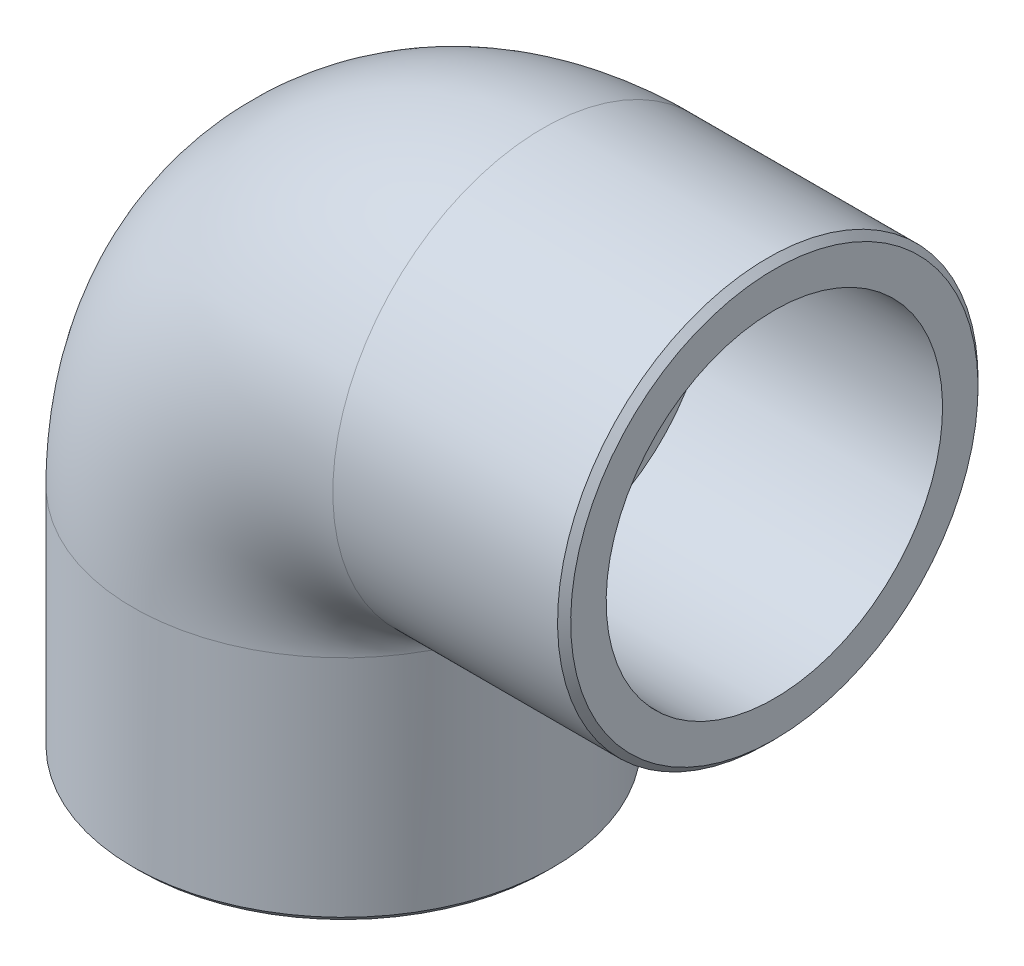
ISO-10303-21;
HEADER;
FILE_DESCRIPTION(('STEP AP214'),'2;1');
FILE_NAME('part.step','',(''),(''),'','','');
FILE_SCHEMA(('AUTOMOTIVE_DESIGN { 1 0 10303 214 1 1 1 1 }'));
ENDSEC;
DATA;
#1=APPLICATION_CONTEXT('core data for automotive mechanical design processes');
#2=APPLICATION_PROTOCOL_DEFINITION('international standard','automotive_design',2000,#1);
#3=PRODUCT_CONTEXT('',#1,'mechanical');
#4=PRODUCT('Part','Part','',(#3));
#5=PRODUCT_RELATED_PRODUCT_CATEGORY('part','',(#4));
#6=PRODUCT_DEFINITION_FORMATION('','',#4);
#7=PRODUCT_DEFINITION_CONTEXT('part definition',#1,'design');
#8=PRODUCT_DEFINITION('design','',#6,#7);
#9=PRODUCT_DEFINITION_SHAPE('','',#8);
#10=(LENGTH_UNIT() NAMED_UNIT(*) SI_UNIT(.MILLI.,.METRE.));
#11=(NAMED_UNIT(*) PLANE_ANGLE_UNIT() SI_UNIT($,.RADIAN.));
#12=(NAMED_UNIT(*) SI_UNIT($,.STERADIAN.) SOLID_ANGLE_UNIT());
#13=UNCERTAINTY_MEASURE_WITH_UNIT(LENGTH_MEASURE(1.E-05),#10,'distance_accuracy_value','');
#14=(GEOMETRIC_REPRESENTATION_CONTEXT(3) GLOBAL_UNCERTAINTY_ASSIGNED_CONTEXT((#13)) GLOBAL_UNIT_ASSIGNED_CONTEXT((#10,
#11,#12)) REPRESENTATION_CONTEXT('',''));
#15=CARTESIAN_POINT('',(0.,0.,0.));
#16=DIRECTION('',(0.,0.,1.));
#17=DIRECTION('',(1.,0.,0.));
#18=AXIS2_PLACEMENT_3D('',#15,#16,#17);
#19=CARTESIAN_POINT('',(-0.481657463317404,-42.8223375673182,-1.1966189299482E-09));
#20=DIRECTION('',(0.,-1.,0.));
#21=DIRECTION('',(0.,0.,-1.));
#22=AXIS2_PLACEMENT_3D('',#19,#20,#21);
#23=CYLINDRICAL_SURFACE('',#22,21.1239);
#24=CARTESIAN_POINT('',(-0.481657463317404,-42.1622156923182,-1.1966189299482E-09));
#25=DIRECTION('',(0.,1.,0.));
#26=DIRECTION('',(0.,0.,1.));
#27=AXIS2_PLACEMENT_3D('',#24,#25,#26);
#28=CIRCLE('',#27,21.1239);
#29=CARTESIAN_POINT('',(-0.481657463317404,-42.1622156923182,21.1238999988034));
#30=VERTEX_POINT('',#29);
#31=EDGE_CURVE('E11',#30,#30,#28,.T.);
#32=ORIENTED_EDGE('',*,*,#31,.T.);
#33=EDGE_LOOP('',(#32));
#34=FACE_BOUND('',#33,.T.);
#35=CARTESIAN_POINT('',(-0.481657463317404,0.48165743268279,-1.1966189299482E-09));
#36=DIRECTION('',(-0.707106781186547,-0.707106781186547,0.));
#37=DIRECTION('',(0.707106781186548,-0.707106781186547,0.));
#38=AXIS2_PLACEMENT_3D('',#35,#36,#37);
#39=ELLIPSE('',#38,29.873705870212,21.1238999999993);
#40=CARTESIAN_POINT('',(19.5860475366845,-19.5860475673187,6.59593565971424));
#41=VERTEX_POINT('',#40);
#42=CARTESIAN_POINT('',(19.5860475366845,-19.5860475673188,-6.59593566210731));
#43=VERTEX_POINT('',#42);
#44=EDGE_CURVE('E51',#41,#43,#39,.F.);
#45=ORIENTED_EDGE('',*,*,#44,.F.);
#46=CARTESIAN_POINT('',(-0.481657463317404,-19.5860475673182,-1.1966189299482E-09));
#47=DIRECTION('',(0.,-1.,0.));
#48=DIRECTION('',(0.,0.,-1.));
#49=AXIS2_PLACEMENT_3D('',#46,#47,#48);
#50=CIRCLE('',#49,21.1239);
#51=EDGE_CURVE('E54',#41,#43,#50,.T.);
#52=ORIENTED_EDGE('',*,*,#51,.T.);
#53=EDGE_LOOP('',(#45,#52));
#54=FACE_BOUND('',#53,.T.);
#55=ADVANCED_FACE('F37',(#34,#54),#23,.T.);
#56=CARTESIAN_POINT('',(-21.6055574633174,-42.8223375673182,-1.1966189299482E-09));
#57=DIRECTION('',(0.,1.,0.));
#58=DIRECTION('',(0.,0.,1.));
#59=AXIS2_PLACEMENT_3D('',#56,#57,#58);
#60=PLANE('',#59);
#61=CARTESIAN_POINT('',(-0.481657463317404,-42.8223375673182,-1.1966189299482E-09));
#62=DIRECTION('',(0.,1.,0.));
#63=DIRECTION('',(0.,0.,1.));
#64=AXIS2_PLACEMENT_3D('',#61,#62,#63);
#65=CIRCLE('',#64,20.463778125);
#66=CARTESIAN_POINT('',(-0.481657463317404,-42.8223375673182,20.4637781238034));
#67=VERTEX_POINT('',#66);
#68=EDGE_CURVE('E45',#67,#67,#65,.F.);
#69=ORIENTED_EDGE('',*,*,#68,.T.);
#70=EDGE_LOOP('',(#69));
#71=FACE_BOUND('',#70,.T.);
#72=CARTESIAN_POINT('',(-0.481657463317404,-42.8223375673182,-1.1966189299482E-09));
#73=DIRECTION('',(0.,-1.,0.));
#74=DIRECTION('',(0.,0.,-1.));
#75=AXIS2_PLACEMENT_3D('',#72,#73,#74);
#76=CIRCLE('',#75,16.89912);
#77=CARTESIAN_POINT('',(-0.481657463317404,-42.8223375673182,-16.8991200011966));
#78=VERTEX_POINT('',#77);
#79=EDGE_CURVE('E136',#78,#78,#76,.T.);
#80=ORIENTED_EDGE('',*,*,#79,.F.);
#81=EDGE_LOOP('',(#80));
#82=FACE_BOUND('',#81,.T.);
#83=ADVANCED_FACE('F79',(#71,#82),#60,.F.);
#84=CARTESIAN_POINT('',(-0.481657463317406,0.48165743268279,-1.1966189299482E-09));
#85=DIRECTION('',(-1.,0.,0.));
#86=DIRECTION('',(0.,-1.,0.));
#87=AXIS2_PLACEMENT_3D('',#84,#85,#86);
#88=CYLINDRICAL_SURFACE('',#87,21.1238999999985);
#89=CARTESIAN_POINT('',(42.1622156616839,0.481657432682793,-1.1966189299482E-09));
#90=DIRECTION('',(-1.,0.,0.));
#91=DIRECTION('',(0.,-1.,0.));
#92=AXIS2_PLACEMENT_3D('',#89,#90,#91);
#93=CIRCLE('',#92,21.1238999999985);
#94=CARTESIAN_POINT('',(42.1622156616839,-20.6422425673157,-1.1966189299482E-09));
#95=VERTEX_POINT('',#94);
#96=EDGE_CURVE('E57',#95,#95,#93,.T.);
#97=ORIENTED_EDGE('',*,*,#96,.T.);
#98=EDGE_LOOP('',(#97));
#99=FACE_BOUND('',#98,.T.);
#100=CARTESIAN_POINT('',(19.5860475366845,0.481657432682792,-1.1966189299482E-09));
#101=DIRECTION('',(-1.,0.,0.));
#102=DIRECTION('',(0.,-1.,0.));
#103=AXIS2_PLACEMENT_3D('',#100,#101,#102);
#104=CIRCLE('',#103,21.123899999999);
#105=EDGE_CURVE('E59',#41,#43,#104,.T.);
#106=ORIENTED_EDGE('',*,*,#105,.F.);
#107=ORIENTED_EDGE('',*,*,#44,.T.);
#108=EDGE_LOOP('',(#106,#107));
#109=FACE_BOUND('',#108,.T.);
#110=ADVANCED_FACE('F64',(#99,#109),#88,.T.);
#111=CARTESIAN_POINT('',(42.8223375366845,21.6055574326807,-1.1966189299482E-09));
#112=DIRECTION('',(-1.,0.,0.));
#113=DIRECTION('',(0.,-1.,0.));
#114=AXIS2_PLACEMENT_3D('',#111,#112,#113);
#115=PLANE('',#114);
#116=CARTESIAN_POINT('',(42.8223375366845,0.481657432682793,-1.1966189299482E-09));
#117=DIRECTION('',(-1.,0.,0.));
#118=DIRECTION('',(0.,-1.,0.));
#119=AXIS2_PLACEMENT_3D('',#116,#117,#118);
#120=CIRCLE('',#119,20.4637781249979);
#121=CARTESIAN_POINT('',(42.8223375366845,-19.9821206923151,-1.1966189299482E-09));
#122=VERTEX_POINT('',#121);
#123=EDGE_CURVE('E74',#122,#122,#120,.F.);
#124=ORIENTED_EDGE('',*,*,#123,.T.);
#125=EDGE_LOOP('',(#124));
#126=FACE_BOUND('',#125,.T.);
#127=CARTESIAN_POINT('',(42.8223375366845,0.481657432679896,-1.1966189299482E-09));
#128=DIRECTION('',(1.,0.,0.));
#129=DIRECTION('',(0.,1.,0.));
#130=AXIS2_PLACEMENT_3D('',#127,#128,#129);
#131=CIRCLE('',#130,16.8991199999991);
#132=CARTESIAN_POINT('',(42.8223375366845,17.380777432679,-1.1966189299482E-09));
#133=VERTEX_POINT('',#132);
#134=EDGE_CURVE('E141',#133,#133,#131,.T.);
#135=ORIENTED_EDGE('',*,*,#134,.F.);
#136=EDGE_LOOP('',(#135));
#137=FACE_BOUND('',#136,.T.);
#138=ADVANCED_FACE('F99',(#126,#137),#115,.F.);
#139=CARTESIAN_POINT('',(-0.481657463317405,-19.5860475673182,-1.1966189299482E-09));
#140=DIRECTION('',(0.,-1.,0.));
#141=DIRECTION('',(-1.,0.,0.));
#142=AXIS2_PLACEMENT_3D('',#139,#140,#141);
#143=CIRCLE('',#142,21.1238999999997);
#144=TRIMMED_CURVE('',#143,(PARAMETER_VALUE(-2.82403222429831)),
(PARAMETER_VALUE(2.82403222429831)),.T.,.PARAMETER.);
#145=CARTESIAN_POINT('',(19.5860475366826,-19.5860475673182,-1.1966189299482E-09));
#146=DIRECTION('',(0.,0.,-1.));
#147=AXIS1_PLACEMENT('',#145,#146);
#148=SURFACE_OF_REVOLUTION('',#144,#147);
#149=ORIENTED_EDGE('',*,*,#105,.T.);
#150=ORIENTED_EDGE('',*,*,#51,.F.);
#151=EDGE_LOOP('',(#149,#150));
#152=FACE_BOUND('',#151,.T.);
#153=ADVANCED_FACE('F60',(#152),#148,.T.);
#154=CARTESIAN_POINT('',(19.5860475366826,-19.5860475673182,-1.1966189299482E-09));
#155=DIRECTION('',(0.,0.,-1.));
#156=DIRECTION('',(-1.,0.,0.));
#157=AXIS2_PLACEMENT_3D('',#154,#155,#156);
#158=TOROIDAL_SURFACE('',#157,20.067705,14.7867299999997);
#159=CARTESIAN_POINT('',(-0.481657463317404,-19.5860475673182,-1.1966189299482E-09));
#160=DIRECTION('',(0.,-1.,0.));
#161=DIRECTION('',(0.,0.,-1.));
#162=AXIS2_PLACEMENT_3D('',#159,#160,#161);
#163=CIRCLE('',#162,14.7867299999997);
#164=CARTESIAN_POINT('',(-15.2683874633171,-19.5860475673182,-1.1966189299482E-09));
#165=VERTEX_POINT('',#164);
#166=EDGE_CURVE('E62',#165,#165,#163,.F.);
#167=CARTESIAN_POINT('',(19.5860475366826,0.481657432681845,-1.1966189299482E-09));
#168=DIRECTION('',(1.,0.,0.));
#169=DIRECTION('',(0.,1.,0.));
#170=AXIS2_PLACEMENT_3D('',#167,#168,#169);
#171=CIRCLE('',#170,14.7867299999997);
#172=CARTESIAN_POINT('',(19.5860475366826,15.2683874326816,-1.1966189299482E-09));
#173=VERTEX_POINT('',#172);
#174=EDGE_CURVE('E134',#173,#173,#171,.F.);
#175=CARTESIAN_POINT('',(19.5860475366826,-19.5860475673182,-1.1966189299482E-09));
#176=DIRECTION('',(0.,0.,-1.));
#177=DIRECTION('',(-1.,0.,0.));
#178=AXIS2_PLACEMENT_3D('',#175,#176,#177);
#179=CIRCLE('',#178,34.8544349999997);
#180=EDGE_CURVE('',#165,#173,#179,.T.);
#181=ORIENTED_EDGE('',*,*,#166,.F.);
#182=ORIENTED_EDGE('',*,*,#174,.F.);
#183=ORIENTED_EDGE('',*,*,#180,.T.);
#184=ORIENTED_EDGE('',*,*,#180,.F.);
#185=EDGE_LOOP('',(#181,#183,#182,#184));
#186=FACE_BOUND('',#185,.T.);
#187=ADVANCED_FACE('F108',(#186),#158,.F.);
#188=CARTESIAN_POINT('',(-0.481657463317404,-19.5860475673182,-1.1966189299482E-09));
#189=DIRECTION('',(0.,-1.,0.));
#190=DIRECTION('',(0.,0.,-1.));
#191=AXIS2_PLACEMENT_3D('',#188,#189,#190);
#192=PLANE('',#191);
#193=CARTESIAN_POINT('',(-0.481657463317404,-19.5860475673182,-1.1966189299482E-09));
#194=DIRECTION('',(0.,-1.,0.));
#195=DIRECTION('',(0.,0.,-1.));
#196=AXIS2_PLACEMENT_3D('',#193,#194,#195);
#197=CIRCLE('',#196,16.89912);
#198=CARTESIAN_POINT('',(-0.481657463317404,-19.5860475673182,-16.8991200011966));
#199=VERTEX_POINT('',#198);
#200=EDGE_CURVE('E139',#199,#199,#197,.T.);
#201=ORIENTED_EDGE('',*,*,#200,.T.);
#202=EDGE_LOOP('',(#201));
#203=FACE_BOUND('',#202,.T.);
#204=ORIENTED_EDGE('',*,*,#166,.T.);
#205=EDGE_LOOP('',(#204));
#206=FACE_BOUND('',#205,.T.);
#207=ADVANCED_FACE('F111',(#203,#206),#192,.T.);
#208=CARTESIAN_POINT('',(-0.481657463317404,-19.5860475673182,-1.1966189299482E-09));
#209=DIRECTION('',(0.,-1.,0.));
#210=DIRECTION('',(0.,0.,-1.));
#211=AXIS2_PLACEMENT_3D('',#208,#209,#210);
#212=CYLINDRICAL_SURFACE('',#211,16.89912);
#213=ORIENTED_EDGE('',*,*,#200,.F.);
#214=EDGE_LOOP('',(#213));
#215=FACE_BOUND('',#214,.T.);
#216=ORIENTED_EDGE('',*,*,#79,.T.);
#217=EDGE_LOOP('',(#216));
#218=FACE_BOUND('',#217,.T.);
#219=ADVANCED_FACE('F113',(#215,#218),#212,.F.);
#220=CARTESIAN_POINT('',(19.5860475366843,0.481657432679896,-1.1966189299482E-09));
#221=DIRECTION('',(1.,0.,0.));
#222=DIRECTION('',(0.,1.,0.));
#223=AXIS2_PLACEMENT_3D('',#220,#221,#222);
#224=PLANE('',#223);
#225=CARTESIAN_POINT('',(19.5860475366843,0.481657432679896,-1.1966189299482E-09));
#226=DIRECTION('',(1.,0.,0.));
#227=DIRECTION('',(0.,1.,0.));
#228=AXIS2_PLACEMENT_3D('',#225,#226,#227);
#229=CIRCLE('',#228,16.8991199999991);
#230=CARTESIAN_POINT('',(19.5860475366843,17.380777432679,-1.1966189299482E-09));
#231=VERTEX_POINT('',#230);
#232=EDGE_CURVE('E131',#231,#231,#229,.T.);
#233=ORIENTED_EDGE('',*,*,#232,.T.);
#234=EDGE_LOOP('',(#233));
#235=FACE_BOUND('',#234,.T.);
#236=ORIENTED_EDGE('',*,*,#174,.T.);
#237=EDGE_LOOP('',(#236));
#238=FACE_BOUND('',#237,.T.);
#239=ADVANCED_FACE('F116',(#235,#238),#224,.T.);
#240=CARTESIAN_POINT('',(19.5860475366843,0.481657432679896,-1.1966189299482E-09));
#241=DIRECTION('',(1.,0.,0.));
#242=DIRECTION('',(0.,1.,0.));
#243=AXIS2_PLACEMENT_3D('',#240,#241,#242);
#244=CYLINDRICAL_SURFACE('',#243,16.8991199999991);
#245=ORIENTED_EDGE('',*,*,#232,.F.);
#246=EDGE_LOOP('',(#245));
#247=FACE_BOUND('',#246,.T.);
#248=ORIENTED_EDGE('',*,*,#134,.T.);
#249=EDGE_LOOP('',(#248));
#250=FACE_BOUND('',#249,.T.);
#251=ADVANCED_FACE('F88',(#247,#250),#244,.F.);
#252=CARTESIAN_POINT('',(42.1622156616839,0.481657432682793,-1.1966189299482E-09));
#253=DIRECTION('',(-1.,0.,0.));
#254=DIRECTION('',(0.,-1.,0.));
#255=AXIS2_PLACEMENT_3D('',#252,#253,#254);
#256=CONICAL_SURFACE('',#255,21.1238999999985,0.785398163397448);
#257=ORIENTED_EDGE('',*,*,#123,.F.);
#258=EDGE_LOOP('',(#257));
#259=FACE_BOUND('',#258,.T.);
#260=ORIENTED_EDGE('',*,*,#96,.F.);
#261=EDGE_LOOP('',(#260));
#262=FACE_BOUND('',#261,.T.);
#263=ADVANCED_FACE('F83',(#259,#262),#256,.T.);
#264=CARTESIAN_POINT('',(-0.481657463317404,-42.8223375673182,-1.1966189299482E-09));
#265=DIRECTION('',(0.,1.,0.));
#266=DIRECTION('',(0.,0.,1.));
#267=AXIS2_PLACEMENT_3D('',#264,#265,#266);
#268=CONICAL_SURFACE('',#267,20.463778125,0.785398163397451);
#269=ORIENTED_EDGE('',*,*,#31,.F.);
#270=EDGE_LOOP('',(#269));
#271=FACE_BOUND('',#270,.T.);
#272=ORIENTED_EDGE('',*,*,#68,.F.);
#273=EDGE_LOOP('',(#272));
#274=FACE_BOUND('',#273,.T.);
#275=ADVANCED_FACE('F39',(#271,#274),#268,.T.);
#276=CLOSED_SHELL('',(#55,#83,#110,#138,#153,#187,#207,#219,#239,#251,#263,#275));
#277=MANIFOLD_SOLID_BREP('B2',#276);
#278=ADVANCED_BREP_SHAPE_REPRESENTATION('',(#18,#277),#14);
#279=SHAPE_DEFINITION_REPRESENTATION(#9,#278);
ENDSEC;
END-ISO-10303-21;
